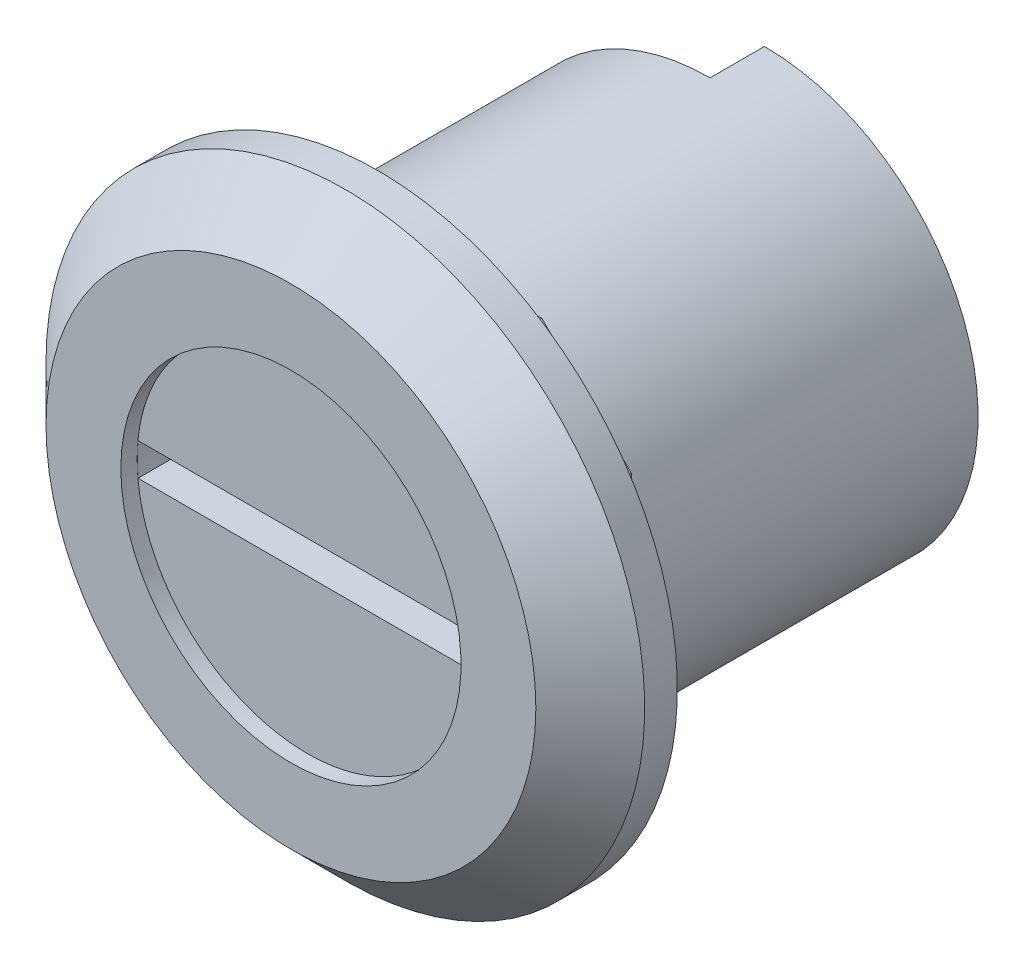
ISO-10303-21;
HEADER;
FILE_DESCRIPTION(('STEP AP214'),'2;1');
FILE_NAME('part.step','',(''),(''),'','','');
FILE_SCHEMA(('AUTOMOTIVE_DESIGN { 1 0 10303 214 1 1 1 1 }'));
ENDSEC;
DATA;
#1=APPLICATION_CONTEXT('core data for automotive mechanical design processes');
#2=APPLICATION_PROTOCOL_DEFINITION('international standard','automotive_design',2000,#1);
#3=PRODUCT_CONTEXT('',#1,'mechanical');
#4=PRODUCT('Part','Part','',(#3));
#5=PRODUCT_RELATED_PRODUCT_CATEGORY('part','',(#4));
#6=PRODUCT_DEFINITION_FORMATION('','',#4);
#7=PRODUCT_DEFINITION_CONTEXT('part definition',#1,'design');
#8=PRODUCT_DEFINITION('design','',#6,#7);
#9=PRODUCT_DEFINITION_SHAPE('','',#8);
#10=(LENGTH_UNIT() NAMED_UNIT(*) SI_UNIT(.MILLI.,.METRE.));
#11=(NAMED_UNIT(*) PLANE_ANGLE_UNIT() SI_UNIT($,.RADIAN.));
#12=(NAMED_UNIT(*) SI_UNIT($,.STERADIAN.) SOLID_ANGLE_UNIT());
#13=UNCERTAINTY_MEASURE_WITH_UNIT(LENGTH_MEASURE(1.E-05),#10,'distance_accuracy_value','');
#14=(GEOMETRIC_REPRESENTATION_CONTEXT(3) GLOBAL_UNCERTAINTY_ASSIGNED_CONTEXT((#13)) GLOBAL_UNIT_ASSIGNED_CONTEXT((#10,
#11,#12)) REPRESENTATION_CONTEXT('',''));
#15=CARTESIAN_POINT('',(0.,0.,0.));
#16=DIRECTION('',(0.,0.,1.));
#17=DIRECTION('',(1.,0.,0.));
#18=AXIS2_PLACEMENT_3D('',#15,#16,#17);
#19=CARTESIAN_POINT('',(0.,0.,1.778));
#20=DIRECTION('',(0.,0.,-1.));
#21=DIRECTION('',(-1.,0.,0.));
#22=AXIS2_PLACEMENT_3D('',#19,#20,#21);
#23=PLANE('',#22);
#24=DIRECTION('',(1.,0.,0.));
#25=VECTOR('',#24,1.);
#26=CARTESIAN_POINT('',(-7.89746684911513,-0.762,1.778));
#27=LINE('',#26,#25);
#28=CARTESIAN_POINT('',(7.89746684911513,-0.761999999999999,1.778));
#29=VERTEX_POINT('',#28);
#30=CARTESIAN_POINT('',(-7.89746684911513,-0.762000000000002,1.778));
#31=VERTEX_POINT('',#30);
#32=EDGE_CURVE('E80',#29,#31,#27,.F.);
#33=ORIENTED_EDGE('',*,*,#32,.F.);
#34=CARTESIAN_POINT('',(0.,0.,1.778));
#35=DIRECTION('',(0.,0.,-1.));
#36=DIRECTION('',(-1.,0.,0.));
#37=AXIS2_PLACEMENT_3D('',#34,#35,#36);
#38=CIRCLE('',#37,7.93414309379863);
#39=CARTESIAN_POINT('',(7.89746684911514,0.762,1.778));
#40=VERTEX_POINT('',#39);
#41=EDGE_CURVE('E84',#29,#40,#38,.F.);
#42=ORIENTED_EDGE('',*,*,#41,.T.);
#43=DIRECTION('',(1.,0.,0.));
#44=VECTOR('',#43,1.);
#45=CARTESIAN_POINT('',(-7.89746684911513,0.762,1.778));
#46=LINE('',#45,#44);
#47=CARTESIAN_POINT('',(-7.89746684911513,0.762,1.778));
#48=VERTEX_POINT('',#47);
#49=EDGE_CURVE('E82',#48,#40,#46,.T.);
#50=ORIENTED_EDGE('',*,*,#49,.F.);
#51=CARTESIAN_POINT('',(0.,0.,1.778));
#52=DIRECTION('',(0.,0.,-1.));
#53=DIRECTION('',(-1.,0.,0.));
#54=AXIS2_PLACEMENT_3D('',#51,#52,#53);
#55=CIRCLE('',#54,7.93414309379863);
#56=EDGE_CURVE('E19',#31,#48,#55,.T.);
#57=ORIENTED_EDGE('',*,*,#56,.F.);
#58=EDGE_LOOP('',(#33,#42,#50,#57));
#59=FACE_BOUND('',#58,.T.);
#60=ADVANCED_FACE('F16',(#59),#23,.F.);
#61=CARTESIAN_POINT('',(-7.89746684911513,-0.762,1.778));
#62=DIRECTION('',(0.,1.,0.));
#63=DIRECTION('',(0.,0.,1.));
#64=AXIS2_PLACEMENT_3D('',#61,#62,#63);
#65=PLANE('',#64);
#66=ORIENTED_EDGE('',*,*,#32,.T.);
#67=DIRECTION('',(0.,0.,-1.));
#68=VECTOR('',#67,1.);
#69=CARTESIAN_POINT('',(-7.89746684911513,-0.762000000000005,1.778));
#70=LINE('',#69,#68);
#71=CARTESIAN_POINT('',(-7.89746684911513,-0.762000000000002,3.302));
#72=VERTEX_POINT('',#71);
#73=EDGE_CURVE('E79',#31,#72,#70,.F.);
#74=ORIENTED_EDGE('',*,*,#73,.T.);
#75=DIRECTION('',(-1.,0.,0.));
#76=VECTOR('',#75,1.);
#77=CARTESIAN_POINT('',(0.,-0.762,3.302));
#78=LINE('',#77,#76);
#79=CARTESIAN_POINT('',(7.89746684911513,-0.761999999999999,3.302));
#80=VERTEX_POINT('',#79);
#81=EDGE_CURVE('E94',#72,#80,#78,.F.);
#82=ORIENTED_EDGE('',*,*,#81,.T.);
#83=DIRECTION('',(0.,0.,-1.));
#84=VECTOR('',#83,1.);
#85=CARTESIAN_POINT('',(7.89746684911514,-0.761999999999998,1.778));
#86=LINE('',#85,#84);
#87=EDGE_CURVE('E99',#80,#29,#86,.T.);
#88=ORIENTED_EDGE('',*,*,#87,.T.);
#89=EDGE_LOOP('',(#66,#74,#82,#88));
#90=FACE_BOUND('',#89,.T.);
#91=ADVANCED_FACE('F551',(#90),#65,.T.);
#92=CARTESIAN_POINT('',(0.,0.,1.778));
#93=DIRECTION('',(0.,0.,-1.));
#94=DIRECTION('',(-1.,0.,0.));
#95=AXIS2_PLACEMENT_3D('',#92,#93,#94);
#96=CYLINDRICAL_SURFACE('',#95,7.93414309379863);
#97=DIRECTION('',(0.,0.,-1.));
#98=VECTOR('',#97,1.);
#99=CARTESIAN_POINT('',(7.89746684911514,0.762,1.778));
#100=LINE('',#99,#98);
#101=CARTESIAN_POINT('',(7.89746684911514,0.762,3.302));
#102=VERTEX_POINT('',#101);
#103=EDGE_CURVE('E88',#40,#102,#100,.F.);
#104=ORIENTED_EDGE('',*,*,#103,.F.);
#105=ORIENTED_EDGE('',*,*,#41,.F.);
#106=ORIENTED_EDGE('',*,*,#87,.F.);
#107=CARTESIAN_POINT('',(0.,0.,3.302));
#108=DIRECTION('',(0.,0.,-1.));
#109=DIRECTION('',(-1.,0.,0.));
#110=AXIS2_PLACEMENT_3D('',#107,#108,#109);
#111=CIRCLE('',#110,7.93414309379863);
#112=EDGE_CURVE('E133',#80,#102,#111,.F.);
#113=ORIENTED_EDGE('',*,*,#112,.T.);
#114=EDGE_LOOP('',(#104,#105,#106,#113));
#115=FACE_BOUND('',#114,.T.);
#116=ADVANCED_FACE('F549',(#115),#96,.F.);
#117=CARTESIAN_POINT('',(-7.89746684911513,0.762,1.778));
#118=DIRECTION('',(0.,-1.,0.));
#119=DIRECTION('',(0.,0.,-1.));
#120=AXIS2_PLACEMENT_3D('',#117,#118,#119);
#121=PLANE('',#120);
#122=ORIENTED_EDGE('',*,*,#49,.T.);
#123=ORIENTED_EDGE('',*,*,#103,.T.);
#124=DIRECTION('',(-1.,0.,0.));
#125=VECTOR('',#124,1.);
#126=CARTESIAN_POINT('',(0.,0.762,3.302));
#127=LINE('',#126,#125);
#128=CARTESIAN_POINT('',(-7.89746684911513,0.762,3.302));
#129=VERTEX_POINT('',#128);
#130=EDGE_CURVE('E92',#102,#129,#127,.T.);
#131=ORIENTED_EDGE('',*,*,#130,.T.);
#132=DIRECTION('',(0.,0.,-1.));
#133=VECTOR('',#132,1.);
#134=CARTESIAN_POINT('',(-7.89746684911513,0.762,1.778));
#135=LINE('',#134,#133);
#136=EDGE_CURVE('E77',#129,#48,#135,.T.);
#137=ORIENTED_EDGE('',*,*,#136,.T.);
#138=EDGE_LOOP('',(#122,#123,#131,#137));
#139=FACE_BOUND('',#138,.T.);
#140=ADVANCED_FACE('F90',(#139),#121,.T.);
#141=CARTESIAN_POINT('',(0.,0.,1.778));
#142=DIRECTION('',(0.,0.,-1.));
#143=DIRECTION('',(-1.,0.,0.));
#144=AXIS2_PLACEMENT_3D('',#141,#142,#143);
#145=CYLINDRICAL_SURFACE('',#144,7.93414309379863);
#146=ORIENTED_EDGE('',*,*,#73,.F.);
#147=ORIENTED_EDGE('',*,*,#56,.T.);
#148=ORIENTED_EDGE('',*,*,#136,.F.);
#149=CARTESIAN_POINT('',(0.,0.,3.302));
#150=DIRECTION('',(0.,0.,-1.));
#151=DIRECTION('',(-1.,0.,0.));
#152=AXIS2_PLACEMENT_3D('',#149,#150,#151);
#153=CIRCLE('',#152,7.93414309379863);
#154=EDGE_CURVE('E131',#129,#72,#153,.F.);
#155=ORIENTED_EDGE('',*,*,#154,.T.);
#156=EDGE_LOOP('',(#146,#147,#148,#155));
#157=FACE_BOUND('',#156,.T.);
#158=ADVANCED_FACE('F74',(#157),#145,.F.);
#159=CARTESIAN_POINT('',(0.,0.,3.302));
#160=DIRECTION('',(0.,0.,-1.));
#161=DIRECTION('',(-1.,0.,0.));
#162=AXIS2_PLACEMENT_3D('',#159,#160,#161);
#163=PLANE('',#162);
#164=ORIENTED_EDGE('',*,*,#130,.F.);
#165=ORIENTED_EDGE('',*,*,#112,.F.);
#166=ORIENTED_EDGE('',*,*,#81,.F.);
#167=ORIENTED_EDGE('',*,*,#154,.F.);
#168=EDGE_LOOP('',(#164,#165,#166,#167));
#169=FACE_BOUND('',#168,.T.);
#170=CARTESIAN_POINT('',(0.,0.,3.302));
#171=DIRECTION('',(0.,0.,-1.));
#172=DIRECTION('',(-1.,0.,0.));
#173=AXIS2_PLACEMENT_3D('',#170,#171,#172);
#174=CIRCLE('',#173,7.9375);
#175=CARTESIAN_POINT('',(-7.9375,0.,3.302));
#176=VERTEX_POINT('',#175);
#177=EDGE_CURVE('E128',#176,#176,#174,.F.);
#178=ORIENTED_EDGE('',*,*,#177,.T.);
#179=EDGE_LOOP('',(#178));
#180=FACE_BOUND('',#179,.T.);
#181=ADVANCED_FACE('F537',(#169,#180),#163,.F.);
#182=CARTESIAN_POINT('',(0.,0.,3.302));
#183=DIRECTION('',(0.,0.,-1.));
#184=DIRECTION('',(-1.,0.,0.));
#185=AXIS2_PLACEMENT_3D('',#182,#183,#184);
#186=CYLINDRICAL_SURFACE('',#185,7.9375);
#187=CARTESIAN_POINT('',(0.,0.,4.064));
#188=DIRECTION('',(0.,0.,-1.));
#189=DIRECTION('',(-1.,0.,0.));
#190=AXIS2_PLACEMENT_3D('',#187,#188,#189);
#191=CIRCLE('',#190,7.9375);
#192=CARTESIAN_POINT('',(-7.9375,0.,4.064));
#193=VERTEX_POINT('',#192);
#194=EDGE_CURVE('E125',#193,#193,#191,.F.);
#195=ORIENTED_EDGE('',*,*,#194,.T.);
#196=EDGE_LOOP('',(#195));
#197=FACE_BOUND('',#196,.T.);
#198=ORIENTED_EDGE('',*,*,#177,.F.);
#199=EDGE_LOOP('',(#198));
#200=FACE_BOUND('',#199,.T.);
#201=ADVANCED_FACE('F531',(#197,#200),#186,.F.);
#202=CARTESIAN_POINT('',(11.43,0.,4.064));
#203=DIRECTION('',(0.,0.,-1.));
#204=DIRECTION('',(-1.,0.,0.));
#205=AXIS2_PLACEMENT_3D('',#202,#203,#204);
#206=PLANE('',#205);
#207=ORIENTED_EDGE('',*,*,#194,.F.);
#208=EDGE_LOOP('',(#207));
#209=FACE_BOUND('',#208,.T.);
#210=CARTESIAN_POINT('',(0.,0.,4.064));
#211=DIRECTION('',(0.,0.,-1.));
#212=DIRECTION('',(-1.,0.,0.));
#213=AXIS2_PLACEMENT_3D('',#210,#211,#212);
#214=CIRCLE('',#213,11.43);
#215=CARTESIAN_POINT('',(-11.43,0.,4.064));
#216=VERTEX_POINT('',#215);
#217=EDGE_CURVE('E121',#216,#216,#214,.T.);
#218=ORIENTED_EDGE('',*,*,#217,.F.);
#219=EDGE_LOOP('',(#218));
#220=FACE_BOUND('',#219,.T.);
#221=ADVANCED_FACE('F526',(#209,#220),#206,.F.);
#222=CARTESIAN_POINT('',(0.,0.,1.524));
#223=DIRECTION('',(0.,0.,-1.));
#224=DIRECTION('',(-1.,0.,0.));
#225=AXIS2_PLACEMENT_3D('',#222,#223,#224);
#226=CONICAL_SURFACE('',#225,13.97,0.785398163397449);
#227=CARTESIAN_POINT('',(0.,0.,1.524));
#228=DIRECTION('',(0.,0.,-1.));
#229=DIRECTION('',(-1.,0.,0.));
#230=AXIS2_PLACEMENT_3D('',#227,#228,#229);
#231=CIRCLE('',#230,13.97);
#232=CARTESIAN_POINT('',(-13.97,0.,1.524));
#233=VERTEX_POINT('',#232);
#234=EDGE_CURVE('E124',#233,#233,#231,.T.);
#235=ORIENTED_EDGE('',*,*,#234,.F.);
#236=EDGE_LOOP('',(#235));
#237=FACE_BOUND('',#236,.T.);
#238=ORIENTED_EDGE('',*,*,#217,.T.);
#239=EDGE_LOOP('',(#238));
#240=FACE_BOUND('',#239,.T.);
#241=ADVANCED_FACE('F389',(#237,#240),#226,.T.);
#242=CARTESIAN_POINT('',(0.,0.,-7.87399999995841));
#243=DIRECTION('',(0.,0.,-1.));
#244=DIRECTION('',(-1.,0.,0.));
#245=AXIS2_PLACEMENT_3D('',#242,#243,#244);
#246=CONICAL_SURFACE('',#245,2.94639999987112,1.02974425860605);
#247=CARTESIAN_POINT('',(0.,1.13686837721616E-10,-6.10362427204336));
#248=VERTEX_POINT('',#247);
#249=VERTEX_LOOP('',#248);
#250=FACE_BOUND('',#249,.T.);
#251=CARTESIAN_POINT('',(0.,0.,-7.874));
#252=DIRECTION('',(0.,0.,-1.));
#253=DIRECTION('',(-1.,0.,0.));
#254=AXIS2_PLACEMENT_3D('',#251,#252,#253);
#255=CIRCLE('',#254,2.9464);
#256=CARTESIAN_POINT('',(-2.9464,0.,-7.874));
#257=VERTEX_POINT('',#256);
#258=EDGE_CURVE('E120',#257,#257,#255,.T.);
#259=ORIENTED_EDGE('',*,*,#258,.T.);
#260=EDGE_LOOP('',(#259));
#261=FACE_BOUND('',#260,.T.);
#262=ADVANCED_FACE('F385',(#250,#261),#246,.F.);
#263=CARTESIAN_POINT('',(0.,0.,7.85098189386056));
#264=DIRECTION('',(0.,0.,-1.));
#265=DIRECTION('',(-1.,0.,0.));
#266=AXIS2_PLACEMENT_3D('',#263,#264,#265);
#267=CYLINDRICAL_SURFACE('',#266,13.97);
#268=CARTESIAN_POINT('',(0.,0.,0.));
#269=DIRECTION('',(0.,0.,-1.));
#270=DIRECTION('',(-1.,0.,0.));
#271=AXIS2_PLACEMENT_3D('',#268,#269,#270);
#272=CIRCLE('',#271,13.97);
#273=CARTESIAN_POINT('',(-13.97,0.,0.));
#274=VERTEX_POINT('',#273);
#275=EDGE_CURVE('E117',#274,#274,#272,.F.);
#276=ORIENTED_EDGE('',*,*,#275,.T.);
#277=EDGE_LOOP('',(#276));
#278=FACE_BOUND('',#277,.T.);
#279=ORIENTED_EDGE('',*,*,#234,.T.);
#280=EDGE_LOOP('',(#279));
#281=FACE_BOUND('',#280,.T.);
#282=ADVANCED_FACE('F388',(#278,#281),#267,.T.);
#283=CARTESIAN_POINT('',(0.,0.,-20.574));
#284=DIRECTION('',(0.,0.,-1.));
#285=DIRECTION('',(-1.,0.,0.));
#286=AXIS2_PLACEMENT_3D('',#283,#284,#285);
#287=CYLINDRICAL_SURFACE('',#286,2.9464);
#288=CARTESIAN_POINT('',(0.,0.,-20.574));
#289=DIRECTION('',(0.,0.,-1.));
#290=DIRECTION('',(-1.,0.,0.));
#291=AXIS2_PLACEMENT_3D('',#288,#289,#290);
#292=CIRCLE('',#291,2.9464);
#293=CARTESIAN_POINT('',(-2.9464,0.,-20.574));
#294=VERTEX_POINT('',#293);
#295=EDGE_CURVE('E113',#294,#294,#292,.T.);
#296=ORIENTED_EDGE('',*,*,#295,.T.);
#297=EDGE_LOOP('',(#296));
#298=FACE_BOUND('',#297,.T.);
#299=ORIENTED_EDGE('',*,*,#258,.F.);
#300=EDGE_LOOP('',(#299));
#301=FACE_BOUND('',#300,.T.);
#302=ADVANCED_FACE('F393',(#298,#301),#287,.F.);
#303=CARTESIAN_POINT('',(0.,0.,0.));
#304=DIRECTION('',(0.,0.,1.));
#305=DIRECTION('',(1.,0.,0.));
#306=AXIS2_PLACEMENT_3D('',#303,#304,#305);
#307=PLANE('',#306);
#308=DIRECTION('',(0.,1.,0.));
#309=VECTOR('',#308,1.);
#310=CARTESIAN_POINT('',(10.0457,5.86731384652865,0.));
#311=LINE('',#310,#309);
#312=CARTESIAN_POINT('',(10.0457,-5.86731384652866,0.));
#313=VERTEX_POINT('',#312);
#314=CARTESIAN_POINT('',(10.0457,5.86731384652865,0.));
#315=VERTEX_POINT('',#314);
#316=EDGE_CURVE('E181',#313,#315,#311,.T.);
#317=ORIENTED_EDGE('',*,*,#316,.T.);
#318=DIRECTION('',(0.707106781186548,-0.707106781186547,0.));
#319=VECTOR('',#318,1.);
#320=CARTESIAN_POINT('',(5.86731384652866,10.0457,0.));
#321=LINE('',#320,#319);
#322=CARTESIAN_POINT('',(5.86731384652866,10.0457,0.));
#323=VERTEX_POINT('',#322);
#324=EDGE_CURVE('E217',#315,#323,#321,.F.);
#325=ORIENTED_EDGE('',*,*,#324,.T.);
#326=DIRECTION('',(1.,0.,0.));
#327=VECTOR('',#326,1.);
#328=CARTESIAN_POINT('',(-5.86731384652866,10.0457,0.));
#329=LINE('',#328,#327);
#330=CARTESIAN_POINT('',(-5.86731384652866,10.0457,0.));
#331=VERTEX_POINT('',#330);
#332=EDGE_CURVE('E211',#323,#331,#329,.F.);
#333=ORIENTED_EDGE('',*,*,#332,.T.);
#334=DIRECTION('',(0.707106781186548,0.707106781186547,0.));
#335=VECTOR('',#334,1.);
#336=CARTESIAN_POINT('',(-5.86731384652866,10.0457,0.));
#337=LINE('',#336,#335);
#338=CARTESIAN_POINT('',(-10.0457,5.86731384652867,0.));
#339=VERTEX_POINT('',#338);
#340=EDGE_CURVE('E205',#331,#339,#337,.F.);
#341=ORIENTED_EDGE('',*,*,#340,.T.);
#342=DIRECTION('',(0.,1.,0.));
#343=VECTOR('',#342,1.);
#344=CARTESIAN_POINT('',(-10.0457,-5.86731384652867,0.));
#345=LINE('',#344,#343);
#346=CARTESIAN_POINT('',(-10.0457,-5.86731384652867,0.));
#347=VERTEX_POINT('',#346);
#348=EDGE_CURVE('E199',#339,#347,#345,.F.);
#349=ORIENTED_EDGE('',*,*,#348,.T.);
#350=DIRECTION('',(-0.707106781186548,0.707106781186548,0.));
#351=VECTOR('',#350,1.);
#352=CARTESIAN_POINT('',(-10.0457,-5.86731384652867,0.));
#353=LINE('',#352,#351);
#354=CARTESIAN_POINT('',(-5.86731384652866,-10.0457,0.));
#355=VERTEX_POINT('',#354);
#356=EDGE_CURVE('E193',#347,#355,#353,.F.);
#357=ORIENTED_EDGE('',*,*,#356,.T.);
#358=DIRECTION('',(1.,0.,0.));
#359=VECTOR('',#358,1.);
#360=CARTESIAN_POINT('',(5.86731384652866,-10.0457,0.));
#361=LINE('',#360,#359);
#362=CARTESIAN_POINT('',(5.86731384652866,-10.0457,0.));
#363=VERTEX_POINT('',#362);
#364=EDGE_CURVE('E187',#355,#363,#361,.T.);
#365=ORIENTED_EDGE('',*,*,#364,.T.);
#366=DIRECTION('',(-0.707106781186548,-0.707106781186547,0.));
#367=VECTOR('',#366,1.);
#368=CARTESIAN_POINT('',(10.0457,-5.86731384652866,0.));
#369=LINE('',#368,#367);
#370=EDGE_CURVE('E116',#363,#313,#369,.F.);
#371=ORIENTED_EDGE('',*,*,#370,.T.);
#372=EDGE_LOOP('',(#317,#325,#333,#341,#349,#357,#365,#371));
#373=FACE_BOUND('',#372,.T.);
#374=ORIENTED_EDGE('',*,*,#275,.F.);
#375=EDGE_LOOP('',(#374));
#376=FACE_BOUND('',#375,.T.);
#377=ADVANCED_FACE('F395',(#373,#376),#307,.F.);
#378=CARTESIAN_POINT('',(4.0005,-4.0005,-20.574));
#379=DIRECTION('',(0.,0.,1.));
#380=DIRECTION('',(1.,0.,0.));
#381=AXIS2_PLACEMENT_3D('',#378,#379,#380);
#382=PLANE('',#381);
#383=DIRECTION('',(0.,1.,0.));
#384=VECTOR('',#383,1.);
#385=CARTESIAN_POINT('',(-4.0005,-4.0005,-20.574));
#386=LINE('',#385,#384);
#387=CARTESIAN_POINT('',(-4.0005,-4.0005,-20.574));
#388=VERTEX_POINT('',#387);
#389=CARTESIAN_POINT('',(-4.0005,4.0005,-20.574));
#390=VERTEX_POINT('',#389);
#391=EDGE_CURVE('E154',#388,#390,#386,.T.);
#392=ORIENTED_EDGE('',*,*,#391,.T.);
#393=DIRECTION('',(1.,0.,0.));
#394=VECTOR('',#393,1.);
#395=CARTESIAN_POINT('',(-4.0005,4.0005,-20.574));
#396=LINE('',#395,#394);
#397=CARTESIAN_POINT('',(4.0005,4.0005,-20.574));
#398=VERTEX_POINT('',#397);
#399=EDGE_CURVE('E173',#390,#398,#396,.T.);
#400=ORIENTED_EDGE('',*,*,#399,.T.);
#401=DIRECTION('',(0.,-1.,0.));
#402=VECTOR('',#401,1.);
#403=CARTESIAN_POINT('',(4.0005,4.0005,-20.574));
#404=LINE('',#403,#402);
#405=CARTESIAN_POINT('',(4.0005,-4.0005,-20.574));
#406=VERTEX_POINT('',#405);
#407=EDGE_CURVE('E160',#398,#406,#404,.T.);
#408=ORIENTED_EDGE('',*,*,#407,.T.);
#409=DIRECTION('',(-1.,0.,0.));
#410=VECTOR('',#409,1.);
#411=CARTESIAN_POINT('',(4.0005,-4.0005,-20.574));
#412=LINE('',#411,#410);
#413=EDGE_CURVE('E155',#406,#388,#412,.T.);
#414=ORIENTED_EDGE('',*,*,#413,.T.);
#415=EDGE_LOOP('',(#392,#400,#408,#414));
#416=FACE_BOUND('',#415,.T.);
#417=ORIENTED_EDGE('',*,*,#295,.F.);
#418=EDGE_LOOP('',(#417));
#419=FACE_BOUND('',#418,.T.);
#420=ADVANCED_FACE('F403',(#416,#419),#382,.F.);
#421=CARTESIAN_POINT('',(10.0457,-5.86731384652866,-1.778));
#422=DIRECTION('',(-0.707106781186547,0.707106781186548,0.));
#423=DIRECTION('',(-0.707106781186548,-0.707106781186547,0.));
#424=AXIS2_PLACEMENT_3D('',#421,#422,#423);
#425=PLANE('',#424);
#426=DIRECTION('',(0.,0.,1.));
#427=VECTOR('',#426,1.);
#428=CARTESIAN_POINT('',(5.86731384652866,-10.0457,-1.778));
#429=LINE('',#428,#427);
#430=CARTESIAN_POINT('',(5.86731384652866,-10.0457,-1.778));
#431=VERTEX_POINT('',#430);
#432=EDGE_CURVE('E184',#363,#431,#429,.F.);
#433=ORIENTED_EDGE('',*,*,#432,.T.);
#434=DIRECTION('',(-0.707106781186547,-0.707106781186548,0.));
#435=VECTOR('',#434,1.);
#436=CARTESIAN_POINT('',(10.0457,-5.86731384652866,-1.778));
#437=LINE('',#436,#435);
#438=CARTESIAN_POINT('',(10.0457,-5.86731384652866,-1.778));
#439=VERTEX_POINT('',#438);
#440=EDGE_CURVE('E261',#439,#431,#437,.T.);
#441=ORIENTED_EDGE('',*,*,#440,.F.);
#442=DIRECTION('',(0.,0.,1.));
#443=VECTOR('',#442,1.);
#444=CARTESIAN_POINT('',(10.0457,-5.86731384652866,-1.778));
#445=LINE('',#444,#443);
#446=EDGE_CURVE('E223',#439,#313,#445,.T.);
#447=ORIENTED_EDGE('',*,*,#446,.T.);
#448=ORIENTED_EDGE('',*,*,#370,.F.);
#449=EDGE_LOOP('',(#433,#441,#447,#448));
#450=FACE_BOUND('',#449,.T.);
#451=ADVANCED_FACE('F470',(#450),#425,.F.);
#452=CARTESIAN_POINT('',(5.86731384652866,-10.0457,-1.778));
#453=DIRECTION('',(0.,1.,0.));
#454=DIRECTION('',(0.,0.,1.));
#455=AXIS2_PLACEMENT_3D('',#452,#453,#454);
#456=PLANE('',#455);
#457=DIRECTION('',(0.,0.,1.));
#458=VECTOR('',#457,1.);
#459=CARTESIAN_POINT('',(-5.86731384652866,-10.0457,-1.778));
#460=LINE('',#459,#458);
#461=CARTESIAN_POINT('',(-5.86731384652865,-10.0457,-1.778));
#462=VERTEX_POINT('',#461);
#463=EDGE_CURVE('E190',#355,#462,#460,.F.);
#464=ORIENTED_EDGE('',*,*,#463,.T.);
#465=DIRECTION('',(-1.,0.,0.));
#466=VECTOR('',#465,1.);
#467=CARTESIAN_POINT('',(0.,-10.0457,-1.778));
#468=LINE('',#467,#466);
#469=EDGE_CURVE('E278',#431,#462,#468,.T.);
#470=ORIENTED_EDGE('',*,*,#469,.F.);
#471=ORIENTED_EDGE('',*,*,#432,.F.);
#472=ORIENTED_EDGE('',*,*,#364,.F.);
#473=EDGE_LOOP('',(#464,#470,#471,#472));
#474=FACE_BOUND('',#473,.T.);
#475=ADVANCED_FACE('F466',(#474),#456,.F.);
#476=CARTESIAN_POINT('',(-10.0457,-5.86731384652867,-1.778));
#477=DIRECTION('',(0.707106781186548,0.707106781186548,0.));
#478=DIRECTION('',(-0.707106781186548,0.707106781186548,0.));
#479=AXIS2_PLACEMENT_3D('',#476,#477,#478);
#480=PLANE('',#479);
#481=DIRECTION('',(0.,0.,-1.));
#482=VECTOR('',#481,1.);
#483=CARTESIAN_POINT('',(-10.0457,-5.86731384652867,-1.778));
#484=LINE('',#483,#482);
#485=CARTESIAN_POINT('',(-10.0457,-5.86731384652867,-1.778));
#486=VERTEX_POINT('',#485);
#487=EDGE_CURVE('E196',#347,#486,#484,.T.);
#488=ORIENTED_EDGE('',*,*,#487,.T.);
#489=DIRECTION('',(-0.707106781186549,0.707106781186546,0.));
#490=VECTOR('',#489,1.);
#491=CARTESIAN_POINT('',(-5.86731384652865,-10.0457,-1.778));
#492=LINE('',#491,#490);
#493=EDGE_CURVE('E281',#462,#486,#492,.T.);
#494=ORIENTED_EDGE('',*,*,#493,.F.);
#495=ORIENTED_EDGE('',*,*,#463,.F.);
#496=ORIENTED_EDGE('',*,*,#356,.F.);
#497=EDGE_LOOP('',(#488,#494,#495,#496));
#498=FACE_BOUND('',#497,.T.);
#499=ADVANCED_FACE('F462',(#498),#480,.F.);
#500=CARTESIAN_POINT('',(-10.0457,-5.86731384652867,-1.778));
#501=DIRECTION('',(1.,0.,0.));
#502=DIRECTION('',(0.,0.,-1.));
#503=AXIS2_PLACEMENT_3D('',#500,#501,#502);
#504=PLANE('',#503);
#505=DIRECTION('',(0.,0.,1.));
#506=VECTOR('',#505,1.);
#507=CARTESIAN_POINT('',(-10.0457,5.86731384652867,-1.778));
#508=LINE('',#507,#506);
#509=CARTESIAN_POINT('',(-10.0457,5.86731384652867,-1.778));
#510=VERTEX_POINT('',#509);
#511=EDGE_CURVE('E202',#339,#510,#508,.F.);
#512=ORIENTED_EDGE('',*,*,#511,.T.);
#513=DIRECTION('',(0.,1.,0.));
#514=VECTOR('',#513,1.);
#515=CARTESIAN_POINT('',(-10.0457,-15.9130138465286,-1.778));
#516=LINE('',#515,#514);
#517=EDGE_CURVE('E284',#486,#510,#516,.T.);
#518=ORIENTED_EDGE('',*,*,#517,.F.);
#519=ORIENTED_EDGE('',*,*,#487,.F.);
#520=ORIENTED_EDGE('',*,*,#348,.F.);
#521=EDGE_LOOP('',(#512,#518,#519,#520));
#522=FACE_BOUND('',#521,.T.);
#523=ADVANCED_FACE('F458',(#522),#504,.F.);
#524=CARTESIAN_POINT('',(-5.86731384652866,10.0457,-1.778));
#525=DIRECTION('',(0.707106781186547,-0.707106781186548,0.));
#526=DIRECTION('',(0.707106781186548,0.707106781186547,0.));
#527=AXIS2_PLACEMENT_3D('',#524,#525,#526);
#528=PLANE('',#527);
#529=DIRECTION('',(0.,0.,-1.));
#530=VECTOR('',#529,1.);
#531=CARTESIAN_POINT('',(-5.86731384652866,10.0457,-1.778));
#532=LINE('',#531,#530);
#533=CARTESIAN_POINT('',(-5.86731384652866,10.0457,-1.778));
#534=VERTEX_POINT('',#533);
#535=EDGE_CURVE('E208',#331,#534,#532,.T.);
#536=ORIENTED_EDGE('',*,*,#535,.T.);
#537=DIRECTION('',(0.707106781186549,0.707106781186547,0.));
#538=VECTOR('',#537,1.);
#539=CARTESIAN_POINT('',(-10.0457,5.86731384652867,-1.778));
#540=LINE('',#539,#538);
#541=EDGE_CURVE('E287',#510,#534,#540,.T.);
#542=ORIENTED_EDGE('',*,*,#541,.F.);
#543=ORIENTED_EDGE('',*,*,#511,.F.);
#544=ORIENTED_EDGE('',*,*,#340,.F.);
#545=EDGE_LOOP('',(#536,#542,#543,#544));
#546=FACE_BOUND('',#545,.T.);
#547=ADVANCED_FACE('F454',(#546),#528,.F.);
#548=CARTESIAN_POINT('',(-5.86731384652866,10.0457,-1.778));
#549=DIRECTION('',(0.,-1.,0.));
#550=DIRECTION('',(0.,0.,-1.));
#551=AXIS2_PLACEMENT_3D('',#548,#549,#550);
#552=PLANE('',#551);
#553=DIRECTION('',(0.,0.,1.));
#554=VECTOR('',#553,1.);
#555=CARTESIAN_POINT('',(5.86731384652866,10.0457,-1.778));
#556=LINE('',#555,#554);
#557=CARTESIAN_POINT('',(5.86731384652866,10.0457,-1.778));
#558=VERTEX_POINT('',#557);
#559=EDGE_CURVE('E214',#323,#558,#556,.F.);
#560=ORIENTED_EDGE('',*,*,#559,.T.);
#561=DIRECTION('',(-1.,0.,0.));
#562=VECTOR('',#561,1.);
#563=CARTESIAN_POINT('',(0.,10.0457,-1.778));
#564=LINE('',#563,#562);
#565=EDGE_CURVE('E290',#534,#558,#564,.F.);
#566=ORIENTED_EDGE('',*,*,#565,.F.);
#567=ORIENTED_EDGE('',*,*,#535,.F.);
#568=ORIENTED_EDGE('',*,*,#332,.F.);
#569=EDGE_LOOP('',(#560,#566,#567,#568));
#570=FACE_BOUND('',#569,.T.);
#571=ADVANCED_FACE('F450',(#570),#552,.F.);
#572=CARTESIAN_POINT('',(5.86731384652866,10.0457,-1.778));
#573=DIRECTION('',(-0.707106781186547,-0.707106781186548,0.));
#574=DIRECTION('',(0.707106781186548,-0.707106781186547,0.));
#575=AXIS2_PLACEMENT_3D('',#572,#573,#574);
#576=PLANE('',#575);
#577=DIRECTION('',(0.,0.,1.));
#578=VECTOR('',#577,1.);
#579=CARTESIAN_POINT('',(10.0457,5.86731384652865,-1.778));
#580=LINE('',#579,#578);
#581=CARTESIAN_POINT('',(10.0457,5.86731384652865,-1.778));
#582=VERTEX_POINT('',#581);
#583=EDGE_CURVE('E220',#315,#582,#580,.F.);
#584=ORIENTED_EDGE('',*,*,#583,.T.);
#585=DIRECTION('',(0.707106781186547,-0.707106781186548,0.));
#586=VECTOR('',#585,1.);
#587=CARTESIAN_POINT('',(5.86731384652866,10.0457,-1.778));
#588=LINE('',#587,#586);
#589=EDGE_CURVE('E293',#558,#582,#588,.T.);
#590=ORIENTED_EDGE('',*,*,#589,.F.);
#591=ORIENTED_EDGE('',*,*,#559,.F.);
#592=ORIENTED_EDGE('',*,*,#324,.F.);
#593=EDGE_LOOP('',(#584,#590,#591,#592));
#594=FACE_BOUND('',#593,.T.);
#595=ADVANCED_FACE('F446',(#594),#576,.F.);
#596=CARTESIAN_POINT('',(10.0457,5.86731384652865,-1.778));
#597=DIRECTION('',(-1.,0.,0.));
#598=DIRECTION('',(0.,0.,1.));
#599=AXIS2_PLACEMENT_3D('',#596,#597,#598);
#600=PLANE('',#599);
#601=ORIENTED_EDGE('',*,*,#446,.F.);
#602=DIRECTION('',(0.,1.,0.));
#603=VECTOR('',#602,1.);
#604=CARTESIAN_POINT('',(10.0457,-15.9130138465286,-1.778));
#605=LINE('',#604,#603);
#606=EDGE_CURVE('E275',#582,#439,#605,.F.);
#607=ORIENTED_EDGE('',*,*,#606,.F.);
#608=ORIENTED_EDGE('',*,*,#583,.F.);
#609=ORIENTED_EDGE('',*,*,#316,.F.);
#610=EDGE_LOOP('',(#601,#607,#608,#609));
#611=FACE_BOUND('',#610,.T.);
#612=ADVANCED_FACE('F442',(#611),#600,.F.);
#613=CARTESIAN_POINT('',(4.0005,4.0005,-20.574));
#614=DIRECTION('',(-1.,0.,0.));
#615=DIRECTION('',(0.,-1.,0.));
#616=AXIS2_PLACEMENT_3D('',#613,#614,#615);
#617=PLANE('',#616);
#618=DIRECTION('',(0.,1.,0.));
#619=VECTOR('',#618,1.);
#620=CARTESIAN_POINT('',(4.0005,0.,-18.034));
#621=LINE('',#620,#619);
#622=CARTESIAN_POINT('',(4.0005,4.0005,-18.034));
#623=VERTEX_POINT('',#622);
#624=CARTESIAN_POINT('',(4.0005,-4.0005,-18.034));
#625=VERTEX_POINT('',#624);
#626=EDGE_CURVE('E253',#623,#625,#621,.F.);
#627=ORIENTED_EDGE('',*,*,#626,.T.);
#628=DIRECTION('',(0.,0.,1.));
#629=VECTOR('',#628,1.);
#630=CARTESIAN_POINT('',(4.0005,-4.0005,-20.574));
#631=LINE('',#630,#629);
#632=EDGE_CURVE('E151',#625,#406,#631,.F.);
#633=ORIENTED_EDGE('',*,*,#632,.T.);
#634=ORIENTED_EDGE('',*,*,#407,.F.);
#635=DIRECTION('',(0.,0.,-1.));
#636=VECTOR('',#635,1.);
#637=CARTESIAN_POINT('',(4.0005,4.0005,-20.574));
#638=LINE('',#637,#636);
#639=EDGE_CURVE('E176',#398,#623,#638,.F.);
#640=ORIENTED_EDGE('',*,*,#639,.T.);
#641=EDGE_LOOP('',(#627,#633,#634,#640));
#642=FACE_BOUND('',#641,.T.);
#643=ADVANCED_FACE('F439',(#642),#617,.F.);
#644=CARTESIAN_POINT('',(4.0005,-4.0005,-20.574));
#645=DIRECTION('',(0.,1.,0.));
#646=DIRECTION('',(-1.,0.,0.));
#647=AXIS2_PLACEMENT_3D('',#644,#645,#646);
#648=PLANE('',#647);
#649=DIRECTION('',(1.,0.,0.));
#650=VECTOR('',#649,1.);
#651=CARTESIAN_POINT('',(0.,-4.0005,-18.034));
#652=LINE('',#651,#650);
#653=CARTESIAN_POINT('',(-4.0005,-4.0005,-18.034));
#654=VERTEX_POINT('',#653);
#655=EDGE_CURVE('E244',#625,#654,#652,.F.);
#656=ORIENTED_EDGE('',*,*,#655,.T.);
#657=DIRECTION('',(0.,0.,-1.));
#658=VECTOR('',#657,1.);
#659=CARTESIAN_POINT('',(-4.0005,-4.0005,-20.574));
#660=LINE('',#659,#658);
#661=EDGE_CURVE('E163',#654,#388,#660,.T.);
#662=ORIENTED_EDGE('',*,*,#661,.T.);
#663=ORIENTED_EDGE('',*,*,#413,.F.);
#664=ORIENTED_EDGE('',*,*,#632,.F.);
#665=EDGE_LOOP('',(#656,#662,#663,#664));
#666=FACE_BOUND('',#665,.T.);
#667=ADVANCED_FACE('F319',(#666),#648,.F.);
#668=CARTESIAN_POINT('',(-4.0005,-4.0005,-20.574));
#669=DIRECTION('',(1.,0.,0.));
#670=DIRECTION('',(0.,0.,-1.));
#671=AXIS2_PLACEMENT_3D('',#668,#669,#670);
#672=PLANE('',#671);
#673=DIRECTION('',(0.,1.,0.));
#674=VECTOR('',#673,1.);
#675=CARTESIAN_POINT('',(-4.0005,0.,-18.034));
#676=LINE('',#675,#674);
#677=CARTESIAN_POINT('',(-4.0005,0.,-18.034));
#678=VERTEX_POINT('',#677);
#679=EDGE_CURVE('E241',#654,#678,#676,.T.);
#680=ORIENTED_EDGE('',*,*,#679,.T.);
#681=DIRECTION('',(0.,0.,-1.));
#682=VECTOR('',#681,1.);
#683=CARTESIAN_POINT('',(-4.0005,0.,-15.494));
#684=LINE('',#683,#682);
#685=CARTESIAN_POINT('',(-4.0005,0.,-15.494));
#686=VERTEX_POINT('',#685);
#687=EDGE_CURVE('E247',#678,#686,#684,.F.);
#688=ORIENTED_EDGE('',*,*,#687,.T.);
#689=DIRECTION('',(0.,1.,0.));
#690=VECTOR('',#689,1.);
#691=CARTESIAN_POINT('',(-4.0005,0.,-15.494));
#692=LINE('',#691,#690);
#693=CARTESIAN_POINT('',(-4.0005,4.0005,-15.494));
#694=VERTEX_POINT('',#693);
#695=EDGE_CURVE('E234',#694,#686,#692,.F.);
#696=ORIENTED_EDGE('',*,*,#695,.F.);
#697=DIRECTION('',(0.,0.,-1.));
#698=VECTOR('',#697,1.);
#699=CARTESIAN_POINT('',(-4.0005,4.0005,-20.574));
#700=LINE('',#699,#698);
#701=EDGE_CURVE('E166',#694,#390,#700,.T.);
#702=ORIENTED_EDGE('',*,*,#701,.T.);
#703=ORIENTED_EDGE('',*,*,#391,.F.);
#704=ORIENTED_EDGE('',*,*,#661,.F.);
#705=EDGE_LOOP('',(#680,#688,#696,#702,#703,#704));
#706=FACE_BOUND('',#705,.T.);
#707=ADVANCED_FACE('F329',(#706),#672,.F.);
#708=CARTESIAN_POINT('',(-4.0005,4.0005,-20.574));
#709=DIRECTION('',(0.,-1.,0.));
#710=DIRECTION('',(0.,0.,-1.));
#711=AXIS2_PLACEMENT_3D('',#708,#709,#710);
#712=PLANE('',#711);
#713=DIRECTION('',(1.,0.,0.));
#714=VECTOR('',#713,1.);
#715=CARTESIAN_POINT('',(0.,4.0005,-18.034));
#716=LINE('',#715,#714);
#717=CARTESIAN_POINT('',(0.,4.0005,-18.034));
#718=VERTEX_POINT('',#717);
#719=EDGE_CURVE('E256',#718,#623,#716,.T.);
#720=ORIENTED_EDGE('',*,*,#719,.T.);
#721=ORIENTED_EDGE('',*,*,#639,.F.);
#722=ORIENTED_EDGE('',*,*,#399,.F.);
#723=ORIENTED_EDGE('',*,*,#701,.F.);
#724=DIRECTION('',(-1.,0.,0.));
#725=VECTOR('',#724,1.);
#726=CARTESIAN_POINT('',(0.,4.0005,-15.494));
#727=LINE('',#726,#725);
#728=CARTESIAN_POINT('',(0.,4.0005,-15.494));
#729=VERTEX_POINT('',#728);
#730=EDGE_CURVE('E238',#729,#694,#727,.T.);
#731=ORIENTED_EDGE('',*,*,#730,.F.);
#732=DIRECTION('',(0.,0.,-1.));
#733=VECTOR('',#732,1.);
#734=CARTESIAN_POINT('',(0.,4.0005,-15.494));
#735=LINE('',#734,#733);
#736=EDGE_CURVE('E112',#729,#718,#735,.T.);
#737=ORIENTED_EDGE('',*,*,#736,.T.);
#738=EDGE_LOOP('',(#720,#721,#722,#723,#731,#737));
#739=FACE_BOUND('',#738,.T.);
#740=ADVANCED_FACE('F430',(#739),#712,.F.);
#741=CARTESIAN_POINT('',(0.,-15.9130138465286,-1.778));
#742=DIRECTION('',(0.,0.,-1.));
#743=DIRECTION('',(-1.,0.,0.));
#744=AXIS2_PLACEMENT_3D('',#741,#742,#743);
#745=PLANE('',#744);
#746=ORIENTED_EDGE('',*,*,#589,.T.);
#747=ORIENTED_EDGE('',*,*,#606,.T.);
#748=ORIENTED_EDGE('',*,*,#440,.T.);
#749=ORIENTED_EDGE('',*,*,#469,.T.);
#750=ORIENTED_EDGE('',*,*,#493,.T.);
#751=ORIENTED_EDGE('',*,*,#517,.T.);
#752=ORIENTED_EDGE('',*,*,#541,.T.);
#753=ORIENTED_EDGE('',*,*,#565,.T.);
#754=EDGE_LOOP('',(#746,#747,#748,#749,#750,#751,#752,#753));
#755=FACE_BOUND('',#754,.T.);
#756=CARTESIAN_POINT('',(0.,0.,-1.778));
#757=DIRECTION('',(0.,0.,-1.));
#758=DIRECTION('',(-1.,0.,0.));
#759=AXIS2_PLACEMENT_3D('',#756,#757,#758);
#760=CIRCLE('',#759,9.9695);
#761=CARTESIAN_POINT('',(-9.9695,0.,-1.778));
#762=VERTEX_POINT('',#761);
#763=EDGE_CURVE('E109',#762,#762,#760,.T.);
#764=ORIENTED_EDGE('',*,*,#763,.F.);
#765=EDGE_LOOP('',(#764));
#766=FACE_BOUND('',#765,.T.);
#767=ADVANCED_FACE('F427',(#755,#766),#745,.T.);
#768=CARTESIAN_POINT('',(0.,0.,-15.494));
#769=DIRECTION('',(0.,0.,-1.));
#770=DIRECTION('',(-1.,0.,0.));
#771=AXIS2_PLACEMENT_3D('',#768,#769,#770);
#772=PLANE('',#771);
#773=CARTESIAN_POINT('',(0.,0.,-15.494));
#774=DIRECTION('',(0.,0.,-1.));
#775=DIRECTION('',(-1.,0.,0.));
#776=AXIS2_PLACEMENT_3D('',#773,#774,#775);
#777=CIRCLE('',#776,9.9695);
#778=CARTESIAN_POINT('',(0.,9.9695,-15.494));
#779=VERTEX_POINT('',#778);
#780=CARTESIAN_POINT('',(-9.9695,0.,-15.494));
#781=VERTEX_POINT('',#780);
#782=EDGE_CURVE('E106',#779,#781,#777,.F.);
#783=ORIENTED_EDGE('',*,*,#782,.F.);
#784=DIRECTION('',(0.,1.,0.));
#785=VECTOR('',#784,1.);
#786=CARTESIAN_POINT('',(0.,0.,-15.494));
#787=LINE('',#786,#785);
#788=EDGE_CURVE('E270',#779,#729,#787,.F.);
#789=ORIENTED_EDGE('',*,*,#788,.T.);
#790=ORIENTED_EDGE('',*,*,#730,.T.);
#791=ORIENTED_EDGE('',*,*,#695,.T.);
#792=DIRECTION('',(1.,0.,0.));
#793=VECTOR('',#792,1.);
#794=CARTESIAN_POINT('',(0.,0.,-15.494));
#795=LINE('',#794,#793);
#796=EDGE_CURVE('E237',#686,#781,#795,.F.);
#797=ORIENTED_EDGE('',*,*,#796,.T.);
#798=EDGE_LOOP('',(#783,#789,#790,#791,#797));
#799=FACE_BOUND('',#798,.T.);
#800=ADVANCED_FACE('F424',(#799),#772,.T.);
#801=CARTESIAN_POINT('',(0.,0.,-15.494));
#802=DIRECTION('',(0.,-1.,0.));
#803=DIRECTION('',(0.,0.,-1.));
#804=AXIS2_PLACEMENT_3D('',#801,#802,#803);
#805=PLANE('',#804);
#806=DIRECTION('',(1.,0.,0.));
#807=VECTOR('',#806,1.);
#808=CARTESIAN_POINT('',(0.,0.,-18.034));
#809=LINE('',#808,#807);
#810=CARTESIAN_POINT('',(-9.9695,0.,-18.034));
#811=VERTEX_POINT('',#810);
#812=EDGE_CURVE('E250',#678,#811,#809,.F.);
#813=ORIENTED_EDGE('',*,*,#812,.T.);
#814=DIRECTION('',(0.,0.,-1.));
#815=VECTOR('',#814,1.);
#816=CARTESIAN_POINT('',(-9.9695,0.,-18.034));
#817=LINE('',#816,#815);
#818=EDGE_CURVE('E105',#781,#811,#817,.T.);
#819=ORIENTED_EDGE('',*,*,#818,.F.);
#820=ORIENTED_EDGE('',*,*,#796,.F.);
#821=ORIENTED_EDGE('',*,*,#687,.F.);
#822=EDGE_LOOP('',(#813,#819,#820,#821));
#823=FACE_BOUND('',#822,.T.);
#824=ADVANCED_FACE('F339',(#823),#805,.F.);
#825=CARTESIAN_POINT('',(0.,0.,-18.034));
#826=DIRECTION('',(0.,0.,1.));
#827=DIRECTION('',(1.,0.,0.));
#828=AXIS2_PLACEMENT_3D('',#825,#826,#827);
#829=PLANE('',#828);
#830=ORIENTED_EDGE('',*,*,#655,.F.);
#831=ORIENTED_EDGE('',*,*,#626,.F.);
#832=ORIENTED_EDGE('',*,*,#719,.F.);
#833=DIRECTION('',(0.,1.,0.));
#834=VECTOR('',#833,1.);
#835=CARTESIAN_POINT('',(0.,0.,-18.034));
#836=LINE('',#835,#834);
#837=CARTESIAN_POINT('',(0.,9.9695,-18.034));
#838=VERTEX_POINT('',#837);
#839=EDGE_CURVE('E34',#718,#838,#836,.T.);
#840=ORIENTED_EDGE('',*,*,#839,.T.);
#841=CARTESIAN_POINT('',(0.,0.,-18.034));
#842=DIRECTION('',(0.,0.,-1.));
#843=DIRECTION('',(-1.,0.,0.));
#844=AXIS2_PLACEMENT_3D('',#841,#842,#843);
#845=CIRCLE('',#844,9.9695);
#846=EDGE_CURVE('E25',#811,#838,#845,.F.);
#847=ORIENTED_EDGE('',*,*,#846,.F.);
#848=ORIENTED_EDGE('',*,*,#812,.F.);
#849=ORIENTED_EDGE('',*,*,#679,.F.);
#850=EDGE_LOOP('',(#830,#831,#832,#840,#847,#848,#849));
#851=FACE_BOUND('',#850,.T.);
#852=ADVANCED_FACE('F332',(#851),#829,.F.);
#853=CARTESIAN_POINT('',(0.,0.,-15.494));
#854=DIRECTION('',(1.,0.,0.));
#855=DIRECTION('',(0.,0.,-1.));
#856=AXIS2_PLACEMENT_3D('',#853,#854,#855);
#857=PLANE('',#856);
#858=ORIENTED_EDGE('',*,*,#788,.F.);
#859=DIRECTION('',(0.,0.,-1.));
#860=VECTOR('',#859,1.);
#861=CARTESIAN_POINT('',(0.,9.9695,-18.034));
#862=LINE('',#861,#860);
#863=EDGE_CURVE('E11',#838,#779,#862,.F.);
#864=ORIENTED_EDGE('',*,*,#863,.F.);
#865=ORIENTED_EDGE('',*,*,#839,.F.);
#866=ORIENTED_EDGE('',*,*,#736,.F.);
#867=EDGE_LOOP('',(#858,#864,#865,#866));
#868=FACE_BOUND('',#867,.T.);
#869=ADVANCED_FACE('F410',(#868),#857,.F.);
#870=CARTESIAN_POINT('',(0.,0.,-18.034));
#871=DIRECTION('',(0.,0.,-1.));
#872=DIRECTION('',(-1.,0.,0.));
#873=AXIS2_PLACEMENT_3D('',#870,#871,#872);
#874=CYLINDRICAL_SURFACE('',#873,9.9695);
#875=ORIENTED_EDGE('',*,*,#846,.T.);
#876=ORIENTED_EDGE('',*,*,#863,.T.);
#877=ORIENTED_EDGE('',*,*,#782,.T.);
#878=ORIENTED_EDGE('',*,*,#818,.T.);
#879=EDGE_LOOP('',(#875,#876,#877,#878));
#880=FACE_BOUND('',#879,.T.);
#881=ORIENTED_EDGE('',*,*,#763,.T.);
#882=EDGE_LOOP('',(#881));
#883=FACE_BOUND('',#882,.T.);
#884=ADVANCED_FACE('F408',(#880,#883),#874,.T.);
#885=CLOSED_SHELL('',(#60,#91,#116,#140,#158,#181,#201,#221,#241,#262,#282,#302,#377,#420,#451,
#475,#499,#523,#547,#571,#595,#612,#643,#667,#707,#740,#767,#800,#824,#852,#869,#884));
#886=MANIFOLD_SOLID_BREP('B1',#885);
#887=ADVANCED_BREP_SHAPE_REPRESENTATION('',(#18,#886),#14);
#888=SHAPE_DEFINITION_REPRESENTATION(#9,#887);
ENDSEC;
END-ISO-10303-21;
